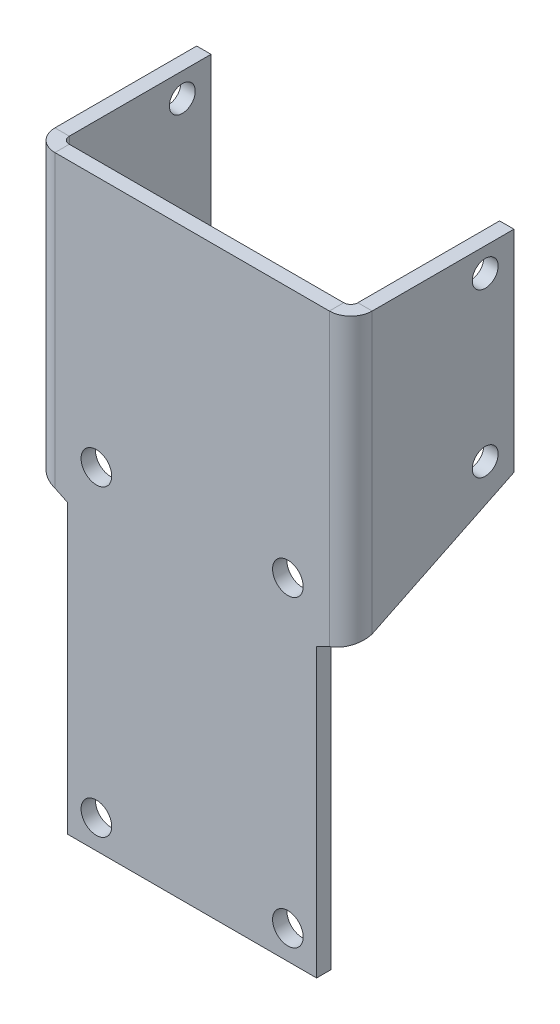
ISO-10303-21;
HEADER;
FILE_DESCRIPTION(('STEP AP214'),'2;1');
FILE_NAME('part.step','',(''),(''),'','','');
FILE_SCHEMA(('AUTOMOTIVE_DESIGN { 1 0 10303 214 1 1 1 1 }'));
ENDSEC;
DATA;
#1=APPLICATION_CONTEXT('core data for automotive mechanical design processes');
#2=APPLICATION_PROTOCOL_DEFINITION('international standard','automotive_design',2000,#1);
#3=PRODUCT_CONTEXT('',#1,'mechanical');
#4=PRODUCT('Part','Part','',(#3));
#5=PRODUCT_RELATED_PRODUCT_CATEGORY('part','',(#4));
#6=PRODUCT_DEFINITION_FORMATION('','',#4);
#7=PRODUCT_DEFINITION_CONTEXT('part definition',#1,'design');
#8=PRODUCT_DEFINITION('design','',#6,#7);
#9=PRODUCT_DEFINITION_SHAPE('','',#8);
#10=(LENGTH_UNIT() NAMED_UNIT(*) SI_UNIT(.MILLI.,.METRE.));
#11=(NAMED_UNIT(*) PLANE_ANGLE_UNIT() SI_UNIT($,.RADIAN.));
#12=(NAMED_UNIT(*) SI_UNIT($,.STERADIAN.) SOLID_ANGLE_UNIT());
#13=UNCERTAINTY_MEASURE_WITH_UNIT(LENGTH_MEASURE(1.E-05),#10,'distance_accuracy_value','');
#14=(GEOMETRIC_REPRESENTATION_CONTEXT(3) GLOBAL_UNCERTAINTY_ASSIGNED_CONTEXT((#13)) GLOBAL_UNIT_ASSIGNED_CONTEXT((#10,
#11,#12)) REPRESENTATION_CONTEXT('',''));
#15=CARTESIAN_POINT('',(0.,0.,0.));
#16=DIRECTION('',(0.,0.,1.));
#17=DIRECTION('',(1.,0.,0.));
#18=AXIS2_PLACEMENT_3D('',#15,#16,#17);
#19=CARTESIAN_POINT('',(-19.475,0.,-1.5));
#20=DIRECTION('',(0.,1.,0.));
#21=DIRECTION('',(-1.,0.,0.));
#22=AXIS2_PLACEMENT_3D('',#19,#20,#21);
#23=PLANE('',#22);
#24=DIRECTION('',(-1.,0.,0.));
#25=VECTOR('',#24,1.);
#26=CARTESIAN_POINT('',(-19.475,0.,-1.5));
#27=LINE('',#26,#25);
#28=CARTESIAN_POINT('',(14.3324270902934,0.,-1.5));
#29=VERTEX_POINT('',#28);
#30=CARTESIAN_POINT('',(-14.3324270902934,0.,-1.5));
#31=VERTEX_POINT('',#30);
#32=EDGE_CURVE('E580',#29,#31,#27,.T.);
#33=ORIENTED_EDGE('',*,*,#32,.T.);
#34=DIRECTION('',(0.,0.,1.));
#35=VECTOR('',#34,1.);
#36=CARTESIAN_POINT('',(-14.3324270902934,0.,-1.5));
#37=LINE('',#36,#35);
#38=CARTESIAN_POINT('',(-14.3324270902934,0.,0.));
#39=VERTEX_POINT('',#38);
#40=EDGE_CURVE('E12',#31,#39,#37,.T.);
#41=ORIENTED_EDGE('',*,*,#40,.T.);
#42=DIRECTION('',(-1.,0.,0.));
#43=VECTOR('',#42,1.);
#44=CARTESIAN_POINT('',(-19.475,0.,0.));
#45=LINE('',#44,#43);
#46=CARTESIAN_POINT('',(14.3324270902934,0.,0.));
#47=VERTEX_POINT('',#46);
#48=EDGE_CURVE('E583',#47,#39,#45,.T.);
#49=ORIENTED_EDGE('',*,*,#48,.F.);
#50=DIRECTION('',(0.,0.,1.));
#51=VECTOR('',#50,1.);
#52=CARTESIAN_POINT('',(14.3324270902934,0.,-1.5));
#53=LINE('',#52,#51);
#54=EDGE_CURVE('E481',#29,#47,#53,.T.);
#55=ORIENTED_EDGE('',*,*,#54,.F.);
#56=EDGE_LOOP('',(#33,#41,#49,#55));
#57=FACE_BOUND('',#56,.T.);
#58=ADVANCED_FACE('F62',(#57),#23,.T.);
#59=CARTESIAN_POINT('',(-31.475,-22.,-1.5));
#60=DIRECTION('',(-0.437944213778862,-0.899002149951609,0.));
#61=DIRECTION('',(0.899002149951609,-0.437944213778862,0.));
#62=AXIS2_PLACEMENT_3D('',#59,#60,#61);
#63=PLANE('',#62);
#64=DIRECTION('',(0.899002149951609,-0.437944213778862,0.));
#65=VECTOR('',#64,1.);
#66=CARTESIAN_POINT('',(-31.475,-22.,0.));
#67=LINE('',#66,#65);
#68=CARTESIAN_POINT('',(-14.3324270902934,-30.3509150845662,0.));
#69=VERTEX_POINT('',#68);
#70=CARTESIAN_POINT('',(-13.,-31.,0.));
#71=VERTEX_POINT('',#70);
#72=EDGE_CURVE('E449',#69,#71,#67,.T.);
#73=ORIENTED_EDGE('',*,*,#72,.F.);
#74=CARTESIAN_POINT('',(-14.3324270902934,-30.3509150845662,-1.5));
#75=CARTESIAN_POINT('',(-14.3324270902933,-30.3509150845662,0.));
#76=B_SPLINE_CURVE_WITH_KNOTS('',1,(#74,#75),.UNSPECIFIED.,.F.,.F.,(2,2),(0.,1.),.UNSPECIFIED.);
#77=CARTESIAN_POINT('',(-14.3324270902934,-30.3509150845662,-1.5));
#78=VERTEX_POINT('',#77);
#79=EDGE_CURVE('E280',#69,#78,#76,.F.);
#80=ORIENTED_EDGE('',*,*,#79,.T.);
#81=DIRECTION('',(0.899002149951609,-0.437944213778862,0.));
#82=VECTOR('',#81,1.);
#83=CARTESIAN_POINT('',(-31.475,-22.,-1.5));
#84=LINE('',#83,#82);
#85=CARTESIAN_POINT('',(-13.,-31.,-1.5));
#86=VERTEX_POINT('',#85);
#87=EDGE_CURVE('E456',#78,#86,#84,.T.);
#88=ORIENTED_EDGE('',*,*,#87,.T.);
#89=DIRECTION('',(0.,0.,1.));
#90=VECTOR('',#89,1.);
#91=CARTESIAN_POINT('',(-13.,-31.,-1.5));
#92=LINE('',#91,#90);
#93=EDGE_CURVE('E478',#86,#71,#92,.T.);
#94=ORIENTED_EDGE('',*,*,#93,.T.);
#95=EDGE_LOOP('',(#73,#80,#88,#94));
#96=FACE_BOUND('',#95,.T.);
#97=ADVANCED_FACE('F517',(#96),#63,.T.);
#98=CARTESIAN_POINT('',(0.,0.,0.));
#99=DIRECTION('',(0.,0.,1.));
#100=DIRECTION('',(1.,0.,0.));
#101=AXIS2_PLACEMENT_3D('',#98,#99,#100);
#102=PLANE('',#101);
#103=CARTESIAN_POINT('',(-10.,-26.3,0.));
#104=DIRECTION('',(0.,0.,1.));
#105=DIRECTION('',(1.,0.,0.));
#106=AXIS2_PLACEMENT_3D('',#103,#104,#105);
#107=CIRCLE('',#106,1.6);
#108=CARTESIAN_POINT('',(-8.40000000000002,-26.3,0.));
#109=VERTEX_POINT('',#108);
#110=EDGE_CURVE('E443',#109,#109,#107,.T.);
#111=ORIENTED_EDGE('',*,*,#110,.F.);
#112=EDGE_LOOP('',(#111));
#113=FACE_BOUND('',#112,.T.);
#114=CARTESIAN_POINT('',(-10.,-58.,0.));
#115=DIRECTION('',(0.,0.,1.));
#116=DIRECTION('',(1.,0.,0.));
#117=AXIS2_PLACEMENT_3D('',#114,#115,#116);
#118=CIRCLE('',#117,1.6);
#119=CARTESIAN_POINT('',(-8.40000000000003,-58.,0.));
#120=VERTEX_POINT('',#119);
#121=EDGE_CURVE('E437',#120,#120,#118,.T.);
#122=ORIENTED_EDGE('',*,*,#121,.F.);
#123=EDGE_LOOP('',(#122));
#124=FACE_BOUND('',#123,.T.);
#125=CARTESIAN_POINT('',(10.,-58.,0.));
#126=DIRECTION('',(0.,0.,1.));
#127=DIRECTION('',(-1.,0.,0.));
#128=AXIS2_PLACEMENT_3D('',#125,#126,#127);
#129=CIRCLE('',#128,1.6);
#130=CARTESIAN_POINT('',(8.40000000000004,-58.,0.));
#131=VERTEX_POINT('',#130);
#132=EDGE_CURVE('E430',#131,#131,#129,.T.);
#133=ORIENTED_EDGE('',*,*,#132,.F.);
#134=EDGE_LOOP('',(#133));
#135=FACE_BOUND('',#134,.T.);
#136=CARTESIAN_POINT('',(10.,-26.3,0.));
#137=DIRECTION('',(0.,0.,1.));
#138=DIRECTION('',(-1.,0.,0.));
#139=AXIS2_PLACEMENT_3D('',#136,#137,#138);
#140=CIRCLE('',#139,1.6);
#141=CARTESIAN_POINT('',(8.40000000000003,-26.3,0.));
#142=VERTEX_POINT('',#141);
#143=EDGE_CURVE('E431',#142,#142,#140,.T.);
#144=ORIENTED_EDGE('',*,*,#143,.F.);
#145=EDGE_LOOP('',(#144));
#146=FACE_BOUND('',#145,.T.);
#147=ORIENTED_EDGE('',*,*,#48,.T.);
#148=DIRECTION('',(0.,-1.,0.));
#149=VECTOR('',#148,1.);
#150=CARTESIAN_POINT('',(-14.3324270902934,0.,0.));
#151=LINE('',#150,#149);
#152=EDGE_CURVE('E70',#39,#69,#151,.T.);
#153=ORIENTED_EDGE('',*,*,#152,.T.);
#154=ORIENTED_EDGE('',*,*,#72,.T.);
#155=DIRECTION('',(0.,-1.,0.));
#156=VECTOR('',#155,1.);
#157=CARTESIAN_POINT('',(-13.,-31.,0.));
#158=LINE('',#157,#156);
#159=CARTESIAN_POINT('',(-13.,-61.,0.));
#160=VERTEX_POINT('',#159);
#161=EDGE_CURVE('E463',#71,#160,#158,.T.);
#162=ORIENTED_EDGE('',*,*,#161,.T.);
#163=DIRECTION('',(1.,0.,0.));
#164=VECTOR('',#163,1.);
#165=CARTESIAN_POINT('',(-13.,-61.,0.));
#166=LINE('',#165,#164);
#167=CARTESIAN_POINT('',(13.,-61.,0.));
#168=VERTEX_POINT('',#167);
#169=EDGE_CURVE('E466',#160,#168,#166,.T.);
#170=ORIENTED_EDGE('',*,*,#169,.T.);
#171=DIRECTION('',(0.,1.,0.));
#172=VECTOR('',#171,1.);
#173=CARTESIAN_POINT('',(13.,-31.,0.));
#174=LINE('',#173,#172);
#175=CARTESIAN_POINT('',(13.,-31.,0.));
#176=VERTEX_POINT('',#175);
#177=EDGE_CURVE('E469',#168,#176,#174,.T.);
#178=ORIENTED_EDGE('',*,*,#177,.T.);
#179=DIRECTION('',(0.899002149951608,0.437944213778862,0.));
#180=VECTOR('',#179,1.);
#181=CARTESIAN_POINT('',(31.475,-22.,0.));
#182=LINE('',#181,#180);
#183=CARTESIAN_POINT('',(14.3324270902934,-30.3509150845662,0.));
#184=VERTEX_POINT('',#183);
#185=EDGE_CURVE('E86',#176,#184,#182,.T.);
#186=ORIENTED_EDGE('',*,*,#185,.T.);
#187=DIRECTION('',(0.,-1.,0.));
#188=VECTOR('',#187,1.);
#189=CARTESIAN_POINT('',(14.3324270902934,0.,0.));
#190=LINE('',#189,#188);
#191=EDGE_CURVE('E484',#47,#184,#190,.T.);
#192=ORIENTED_EDGE('',*,*,#191,.F.);
#193=EDGE_LOOP('',(#147,#153,#154,#162,#170,#178,#186,#192));
#194=FACE_BOUND('',#193,.T.);
#195=ADVANCED_FACE('F515',(#113,#124,#135,#146,#194),#102,.T.);
#196=CARTESIAN_POINT('',(0.,0.,-1.5));
#197=DIRECTION('',(0.,0.,1.));
#198=DIRECTION('',(1.,0.,0.));
#199=AXIS2_PLACEMENT_3D('',#196,#197,#198);
#200=PLANE('',#199);
#201=DIRECTION('',(0.,-1.,0.));
#202=VECTOR('',#201,1.);
#203=CARTESIAN_POINT('',(-14.3324270902934,0.,-1.5));
#204=LINE('',#203,#202);
#205=EDGE_CURVE('E590',#31,#78,#204,.T.);
#206=ORIENTED_EDGE('',*,*,#205,.F.);
#207=ORIENTED_EDGE('',*,*,#32,.F.);
#208=DIRECTION('',(0.,-1.,0.));
#209=VECTOR('',#208,1.);
#210=CARTESIAN_POINT('',(14.3324270902934,0.,-1.5));
#211=LINE('',#210,#209);
#212=CARTESIAN_POINT('',(14.3324270902934,-30.3509150845662,-1.5));
#213=VERTEX_POINT('',#212);
#214=EDGE_CURVE('E473',#29,#213,#211,.T.);
#215=ORIENTED_EDGE('',*,*,#214,.T.);
#216=DIRECTION('',(0.899002149951608,0.437944213778862,0.));
#217=VECTOR('',#216,1.);
#218=CARTESIAN_POINT('',(31.475,-22.,-1.5));
#219=LINE('',#218,#217);
#220=CARTESIAN_POINT('',(13.,-31.,-1.5));
#221=VERTEX_POINT('',#220);
#222=EDGE_CURVE('E462',#221,#213,#219,.T.);
#223=ORIENTED_EDGE('',*,*,#222,.F.);
#224=DIRECTION('',(0.,1.,0.));
#225=VECTOR('',#224,1.);
#226=CARTESIAN_POINT('',(13.,-31.,-1.5));
#227=LINE('',#226,#225);
#228=CARTESIAN_POINT('',(13.,-61.,-1.5));
#229=VERTEX_POINT('',#228);
#230=EDGE_CURVE('E459',#229,#221,#227,.T.);
#231=ORIENTED_EDGE('',*,*,#230,.F.);
#232=DIRECTION('',(1.,0.,0.));
#233=VECTOR('',#232,1.);
#234=CARTESIAN_POINT('',(-13.,-61.,-1.5));
#235=LINE('',#234,#233);
#236=CARTESIAN_POINT('',(-13.,-61.,-1.5));
#237=VERTEX_POINT('',#236);
#238=EDGE_CURVE('E455',#237,#229,#235,.T.);
#239=ORIENTED_EDGE('',*,*,#238,.F.);
#240=DIRECTION('',(0.,-1.,0.));
#241=VECTOR('',#240,1.);
#242=CARTESIAN_POINT('',(-13.,-31.,-1.5));
#243=LINE('',#242,#241);
#244=EDGE_CURVE('E452',#86,#237,#243,.T.);
#245=ORIENTED_EDGE('',*,*,#244,.F.);
#246=ORIENTED_EDGE('',*,*,#87,.F.);
#247=EDGE_LOOP('',(#206,#207,#215,#223,#231,#239,#245,#246));
#248=FACE_BOUND('',#247,.T.);
#249=CARTESIAN_POINT('',(-10.,-26.3,-1.5));
#250=DIRECTION('',(0.,0.,1.));
#251=DIRECTION('',(1.,0.,0.));
#252=AXIS2_PLACEMENT_3D('',#249,#250,#251);
#253=CIRCLE('',#252,1.6);
#254=CARTESIAN_POINT('',(-8.40000000000002,-26.3,-1.5));
#255=VERTEX_POINT('',#254);
#256=EDGE_CURVE('E446',#255,#255,#253,.T.);
#257=ORIENTED_EDGE('',*,*,#256,.T.);
#258=EDGE_LOOP('',(#257));
#259=FACE_BOUND('',#258,.T.);
#260=CARTESIAN_POINT('',(-10.,-58.,-1.5));
#261=DIRECTION('',(0.,0.,1.));
#262=DIRECTION('',(1.,0.,0.));
#263=AXIS2_PLACEMENT_3D('',#260,#261,#262);
#264=CIRCLE('',#263,1.6);
#265=CARTESIAN_POINT('',(-8.40000000000003,-58.,-1.5));
#266=VERTEX_POINT('',#265);
#267=EDGE_CURVE('E440',#266,#266,#264,.T.);
#268=ORIENTED_EDGE('',*,*,#267,.T.);
#269=EDGE_LOOP('',(#268));
#270=FACE_BOUND('',#269,.T.);
#271=CARTESIAN_POINT('',(10.,-58.,-1.5));
#272=DIRECTION('',(0.,0.,1.));
#273=DIRECTION('',(-1.,0.,0.));
#274=AXIS2_PLACEMENT_3D('',#271,#272,#273);
#275=CIRCLE('',#274,1.6);
#276=CARTESIAN_POINT('',(8.40000000000004,-58.,-1.5));
#277=VERTEX_POINT('',#276);
#278=EDGE_CURVE('E434',#277,#277,#275,.T.);
#279=ORIENTED_EDGE('',*,*,#278,.T.);
#280=EDGE_LOOP('',(#279));
#281=FACE_BOUND('',#280,.T.);
#282=CARTESIAN_POINT('',(10.,-26.3,-1.5));
#283=DIRECTION('',(0.,0.,1.));
#284=DIRECTION('',(-1.,0.,0.));
#285=AXIS2_PLACEMENT_3D('',#282,#283,#284);
#286=CIRCLE('',#285,1.6);
#287=CARTESIAN_POINT('',(8.40000000000003,-26.3,-1.5));
#288=VERTEX_POINT('',#287);
#289=EDGE_CURVE('E422',#288,#288,#286,.T.);
#290=ORIENTED_EDGE('',*,*,#289,.T.);
#291=EDGE_LOOP('',(#290));
#292=FACE_BOUND('',#291,.T.);
#293=ADVANCED_FACE('F510',(#248,#259,#270,#281,#292),#200,.F.);
#294=CARTESIAN_POINT('',(31.475,-22.,-1.5));
#295=DIRECTION('',(0.437944213778862,-0.899002149951608,0.));
#296=DIRECTION('',(0.899002149951608,0.437944213778862,0.));
#297=AXIS2_PLACEMENT_3D('',#294,#295,#296);
#298=PLANE('',#297);
#299=CARTESIAN_POINT('',(14.3324270902934,-30.3509150845662,0.));
#300=CARTESIAN_POINT('',(14.3324270902934,-30.3509150845662,-1.5));
#301=B_SPLINE_CURVE_WITH_KNOTS('',1,(#299,#300),.UNSPECIFIED.,.F.,.F.,(2,2),(0.,1.),.UNSPECIFIED.);
#302=EDGE_CURVE('E418',#184,#213,#301,.T.);
#303=ORIENTED_EDGE('',*,*,#302,.F.);
#304=ORIENTED_EDGE('',*,*,#185,.F.);
#305=DIRECTION('',(0.,0.,1.));
#306=VECTOR('',#305,1.);
#307=CARTESIAN_POINT('',(13.,-31.,-1.5));
#308=LINE('',#307,#306);
#309=EDGE_CURVE('E471',#221,#176,#308,.T.);
#310=ORIENTED_EDGE('',*,*,#309,.F.);
#311=ORIENTED_EDGE('',*,*,#222,.T.);
#312=EDGE_LOOP('',(#303,#304,#310,#311));
#313=FACE_BOUND('',#312,.T.);
#314=ADVANCED_FACE('F499',(#313),#298,.T.);
#315=CARTESIAN_POINT('',(13.,-31.,-1.5));
#316=DIRECTION('',(1.,0.,0.));
#317=DIRECTION('',(0.,1.,0.));
#318=AXIS2_PLACEMENT_3D('',#315,#316,#317);
#319=PLANE('',#318);
#320=ORIENTED_EDGE('',*,*,#177,.F.);
#321=DIRECTION('',(0.,0.,1.));
#322=VECTOR('',#321,1.);
#323=CARTESIAN_POINT('',(13.,-61.,-1.5));
#324=LINE('',#323,#322);
#325=EDGE_CURVE('E474',#229,#168,#324,.T.);
#326=ORIENTED_EDGE('',*,*,#325,.F.);
#327=ORIENTED_EDGE('',*,*,#230,.T.);
#328=ORIENTED_EDGE('',*,*,#309,.T.);
#329=EDGE_LOOP('',(#320,#326,#327,#328));
#330=FACE_BOUND('',#329,.T.);
#331=ADVANCED_FACE('F509',(#330),#319,.T.);
#332=CARTESIAN_POINT('',(-13.,-61.,-1.5));
#333=DIRECTION('',(0.,-1.,0.));
#334=DIRECTION('',(0.,0.,-1.));
#335=AXIS2_PLACEMENT_3D('',#332,#333,#334);
#336=PLANE('',#335);
#337=ORIENTED_EDGE('',*,*,#169,.F.);
#338=DIRECTION('',(0.,0.,1.));
#339=VECTOR('',#338,1.);
#340=CARTESIAN_POINT('',(-13.,-61.,-1.5));
#341=LINE('',#340,#339);
#342=EDGE_CURVE('E476',#237,#160,#341,.T.);
#343=ORIENTED_EDGE('',*,*,#342,.F.);
#344=ORIENTED_EDGE('',*,*,#238,.T.);
#345=ORIENTED_EDGE('',*,*,#325,.T.);
#346=EDGE_LOOP('',(#337,#343,#344,#345));
#347=FACE_BOUND('',#346,.T.);
#348=ADVANCED_FACE('F610',(#347),#336,.T.);
#349=CARTESIAN_POINT('',(-13.,-31.,-1.5));
#350=DIRECTION('',(-1.,0.,0.));
#351=DIRECTION('',(0.,-1.,0.));
#352=AXIS2_PLACEMENT_3D('',#349,#350,#351);
#353=PLANE('',#352);
#354=ORIENTED_EDGE('',*,*,#161,.F.);
#355=ORIENTED_EDGE('',*,*,#93,.F.);
#356=ORIENTED_EDGE('',*,*,#244,.T.);
#357=ORIENTED_EDGE('',*,*,#342,.T.);
#358=EDGE_LOOP('',(#354,#355,#356,#357));
#359=FACE_BOUND('',#358,.T.);
#360=ADVANCED_FACE('F511',(#359),#353,.T.);
#361=CARTESIAN_POINT('',(-10.,-26.3,-1.5));
#362=DIRECTION('',(0.,0.,1.));
#363=DIRECTION('',(1.,0.,0.));
#364=AXIS2_PLACEMENT_3D('',#361,#362,#363);
#365=CYLINDRICAL_SURFACE('',#364,1.6);
#366=ORIENTED_EDGE('',*,*,#256,.F.);
#367=EDGE_LOOP('',(#366));
#368=FACE_BOUND('',#367,.T.);
#369=ORIENTED_EDGE('',*,*,#110,.T.);
#370=EDGE_LOOP('',(#369));
#371=FACE_BOUND('',#370,.T.);
#372=ADVANCED_FACE('F824',(#368,#371),#365,.F.);
#373=CARTESIAN_POINT('',(-10.,-58.,-1.5));
#374=DIRECTION('',(0.,0.,1.));
#375=DIRECTION('',(1.,0.,0.));
#376=AXIS2_PLACEMENT_3D('',#373,#374,#375);
#377=CYLINDRICAL_SURFACE('',#376,1.6);
#378=ORIENTED_EDGE('',*,*,#267,.F.);
#379=EDGE_LOOP('',(#378));
#380=FACE_BOUND('',#379,.T.);
#381=ORIENTED_EDGE('',*,*,#121,.T.);
#382=EDGE_LOOP('',(#381));
#383=FACE_BOUND('',#382,.T.);
#384=ADVANCED_FACE('F813',(#380,#383),#377,.F.);
#385=CARTESIAN_POINT('',(10.,-58.,-1.5));
#386=DIRECTION('',(0.,0.,1.));
#387=DIRECTION('',(1.,0.,0.));
#388=AXIS2_PLACEMENT_3D('',#385,#386,#387);
#389=CYLINDRICAL_SURFACE('',#388,1.6);
#390=ORIENTED_EDGE('',*,*,#278,.F.);
#391=EDGE_LOOP('',(#390));
#392=FACE_BOUND('',#391,.T.);
#393=ORIENTED_EDGE('',*,*,#132,.T.);
#394=EDGE_LOOP('',(#393));
#395=FACE_BOUND('',#394,.T.);
#396=ADVANCED_FACE('F803',(#392,#395),#389,.F.);
#397=CARTESIAN_POINT('',(10.,-26.3,-1.5));
#398=DIRECTION('',(0.,0.,1.));
#399=DIRECTION('',(1.,0.,0.));
#400=AXIS2_PLACEMENT_3D('',#397,#398,#399);
#401=CYLINDRICAL_SURFACE('',#400,1.6);
#402=ORIENTED_EDGE('',*,*,#289,.F.);
#403=EDGE_LOOP('',(#402));
#404=FACE_BOUND('',#403,.T.);
#405=ORIENTED_EDGE('',*,*,#143,.T.);
#406=EDGE_LOOP('',(#405));
#407=FACE_BOUND('',#406,.T.);
#408=ADVANCED_FACE('F756',(#404,#407),#401,.F.);
#409=CARTESIAN_POINT('',(14.3324270902934,0.,-2.2366));
#410=DIRECTION('',(0.,-1.,0.));
#411=DIRECTION('',(0.,0.,-1.));
#412=AXIS2_PLACEMENT_3D('',#409,#410,#411);
#413=PLANE('',#412);
#414=ORIENTED_EDGE('',*,*,#54,.T.);
#415=CARTESIAN_POINT('',(14.3324270902934,0.,-2.2366));
#416=DIRECTION('',(0.,-1.,0.));
#417=DIRECTION('',(0.,0.,-1.));
#418=AXIS2_PLACEMENT_3D('',#415,#416,#417);
#419=CIRCLE('',#418,2.2366);
#420=CARTESIAN_POINT('',(16.5690270902933,0.,-2.23660000000001));
#421=VERTEX_POINT('',#420);
#422=EDGE_CURVE('E302',#47,#421,#419,.F.);
#423=ORIENTED_EDGE('',*,*,#422,.T.);
#424=DIRECTION('',(1.,0.,0.));
#425=VECTOR('',#424,1.);
#426=CARTESIAN_POINT('',(15.0690270902933,0.,-2.23660000000001));
#427=LINE('',#426,#425);
#428=CARTESIAN_POINT('',(15.0690270902933,0.,-2.23660000000001));
#429=VERTEX_POINT('',#428);
#430=EDGE_CURVE('E312',#429,#421,#427,.T.);
#431=ORIENTED_EDGE('',*,*,#430,.F.);
#432=CARTESIAN_POINT('',(14.3324270902934,0.,-2.2366));
#433=DIRECTION('',(0.,1.,0.));
#434=DIRECTION('',(0.,0.,-1.));
#435=AXIS2_PLACEMENT_3D('',#432,#433,#434);
#436=CIRCLE('',#435,0.7366);
#437=EDGE_CURVE('E337',#29,#429,#436,.T.);
#438=ORIENTED_EDGE('',*,*,#437,.F.);
#439=EDGE_LOOP('',(#414,#423,#431,#438));
#440=FACE_BOUND('',#439,.T.);
#441=ADVANCED_FACE('F598',(#440),#413,.F.);
#442=CARTESIAN_POINT('',(16.5690270902934,-29.2133609641483,-2.23660000000001));
#443=CARTESIAN_POINT('',(16.5690270902934,-29.3081726105013,-1.94378196786791));
#444=CARTESIAN_POINT('',(16.5108143789297,-29.4029533175513,-1.65117468184204));
#445=CARTESIAN_POINT('',(16.2867377264865,-29.5925456709543,-1.11020578850245));
#446=CARTESIAN_POINT('',(16.1209619500011,-29.6873418476557,-0.86210480610411));
#447=CARTESIAN_POINT('',(15.7069222841893,-29.8769342010587,-0.448065140292233));
#448=CARTESIAN_POINT('',(15.4588213017909,-29.9717303777602,-0.282289363806868));
#449=CARTESIAN_POINT('',(14.9178524084513,-30.1613227311632,-0.0582127113636455));
#450=CARTESIAN_POINT('',(14.6252451224255,-30.2561034382131,0.));
#451=CARTESIAN_POINT('',(14.3324270902934,-30.3509150845662,0.));
#452=CARTESIAN_POINT('',(15.0690270902934,-29.2133609641483,-2.2366));
#453=CARTESIAN_POINT('',(15.0690270902934,-29.3081658317912,-2.14017044559401));
#454=CARTESIAN_POINT('',(15.0498553639272,-29.4029533175513,-2.04379650838096));
#455=CARTESIAN_POINT('',(14.9760581439551,-29.5925456709543,-1.8656342590588));
#456=CARTESIAN_POINT('',(14.9214616864039,-29.6873418476557,-1.78392488606648));
#457=CARTESIAN_POINT('',(14.7851022042269,-29.8769342010587,-1.6475654038895));
#458=CARTESIAN_POINT('',(14.7033928312346,-29.9717303777602,-1.59296894633825));
#459=CARTESIAN_POINT('',(14.5252305819124,-30.1613227311632,-1.51917172636612));
#460=CARTESIAN_POINT('',(14.4288566446993,-30.2561102169232,-1.5));
#461=CARTESIAN_POINT('',(14.3324270902934,-30.3509150845662,-1.5));
#462=B_SPLINE_SURFACE_WITH_KNOTS('',1,3,((#442,#443,#444,#445,#446,#447,#448,#449,#450,#451),
(#452,#453,#454,#455,#456,#457,#458,#459,#460,#461)),.UNSPECIFIED.,.F.,.F.,.F.,(2,2),(4,2,2,2,
4),(0.,1.),(0.,0.25,0.5,0.75,1.),.UNSPECIFIED.);
#463=CARTESIAN_POINT('',(15.0690270902934,-29.2133609641483,-2.2366));
#464=CARTESIAN_POINT('',(16.5690270902934,-29.2133609641483,-2.23660000000001));
#465=B_SPLINE_CURVE_WITH_KNOTS('',1,(#463,#464),.UNSPECIFIED.,.F.,.F.,(2,2),(0.,1.),.UNSPECIFIED.);
#466=CARTESIAN_POINT('',(16.5690270902933,-29.2133609641483,-2.23660000000001));
#467=VERTEX_POINT('',#466);
#468=CARTESIAN_POINT('',(15.0690270902934,-29.2133609641483,-2.2366));
#469=VERTEX_POINT('',#468);
#470=EDGE_CURVE('E307',#467,#469,#465,.F.);
#471=CARTESIAN_POINT('',(16.5690270902934,-29.2133609641483,-2.23660000000001));
#472=CARTESIAN_POINT('',(16.5690270902934,-29.3081726105013,-1.94378196786791));
#473=CARTESIAN_POINT('',(16.5108143789297,-29.4029533175513,-1.65117468184204));
#474=CARTESIAN_POINT('',(16.2867377264865,-29.5925456709543,-1.11020578850245));
#475=CARTESIAN_POINT('',(16.1209619500011,-29.6873418476557,-0.86210480610411));
#476=CARTESIAN_POINT('',(15.7069222841893,-29.8769342010587,-0.448065140292233));
#477=CARTESIAN_POINT('',(15.4588213017909,-29.9717303777602,-0.282289363806868));
#478=CARTESIAN_POINT('',(14.9178524084513,-30.1613227311632,-0.0582127113636455));
#479=CARTESIAN_POINT('',(14.6252451224255,-30.2561034382131,0.));
#480=CARTESIAN_POINT('',(14.3324270902934,-30.3509150845662,0.));
#481=B_SPLINE_CURVE_WITH_KNOTS('',3,(#471,#472,#473,#474,#475,#476,#477,#478,#479,#480),
.UNSPECIFIED.,.F.,.F.,(4,2,2,2,4),(0.,0.25,0.5,0.75,1.),.UNSPECIFIED.);
#482=EDGE_CURVE('E341',#467,#184,#481,.T.);
#483=CARTESIAN_POINT('',(14.3324270902934,-30.3509150845662,-1.5));
#484=CARTESIAN_POINT('',(14.4288566446993,-30.2561102169232,-1.5));
#485=CARTESIAN_POINT('',(14.5252305819124,-30.1613227311632,-1.51917172636612));
#486=CARTESIAN_POINT('',(14.7033928312346,-29.9717303777602,-1.59296894633825));
#487=CARTESIAN_POINT('',(14.7851022042269,-29.8769342010587,-1.6475654038895));
#488=CARTESIAN_POINT('',(14.9214616864039,-29.6873418476557,-1.78392488606648));
#489=CARTESIAN_POINT('',(14.9760581439551,-29.5925456709543,-1.8656342590588));
#490=CARTESIAN_POINT('',(15.0498553639272,-29.4029533175513,-2.04379650838096));
#491=CARTESIAN_POINT('',(15.0690270902934,-29.3081658317912,-2.14017044559401));
#492=CARTESIAN_POINT('',(15.0690270902934,-29.2133609641483,-2.2366));
#493=B_SPLINE_CURVE_WITH_KNOTS('',3,(#483,#484,#485,#486,#487,#488,#489,#490,#491,#492),
.UNSPECIFIED.,.F.,.F.,(4,2,2,2,4),(0.,0.25,0.5,0.75,1.),.UNSPECIFIED.);
#494=EDGE_CURVE('E340',#469,#213,#493,.F.);
#495=ORIENTED_EDGE('',*,*,#470,.F.);
#496=ORIENTED_EDGE('',*,*,#482,.T.);
#497=ORIENTED_EDGE('',*,*,#302,.T.);
#498=ORIENTED_EDGE('',*,*,#494,.F.);
#499=EDGE_LOOP('',(#495,#496,#497,#498));
#500=FACE_BOUND('',#499,.T.);
#501=ADVANCED_FACE('F358',(#500),#462,.F.);
#502=CARTESIAN_POINT('',(14.3324270902934,15.3020907919985,-2.2366));
#503=DIRECTION('',(0.,-1.,0.));
#504=DIRECTION('',(0.,0.,-1.));
#505=AXIS2_PLACEMENT_3D('',#502,#503,#504);
#506=CYLINDRICAL_SURFACE('',#505,0.7366);
#507=ORIENTED_EDGE('',*,*,#494,.T.);
#508=ORIENTED_EDGE('',*,*,#214,.F.);
#509=ORIENTED_EDGE('',*,*,#437,.T.);
#510=DIRECTION('',(0.,-1.,0.));
#511=VECTOR('',#510,1.);
#512=CARTESIAN_POINT('',(15.0690270902933,0.,-2.2366));
#513=LINE('',#512,#511);
#514=EDGE_CURVE('E336',#429,#469,#513,.T.);
#515=ORIENTED_EDGE('',*,*,#514,.T.);
#516=EDGE_LOOP('',(#507,#508,#509,#515));
#517=FACE_BOUND('',#516,.T.);
#518=ADVANCED_FACE('F347',(#517),#506,.F.);
#519=CARTESIAN_POINT('',(14.3324270902934,15.3020907919985,-2.2366));
#520=DIRECTION('',(0.,-1.,0.));
#521=DIRECTION('',(0.,0.,-1.));
#522=AXIS2_PLACEMENT_3D('',#519,#520,#521);
#523=CYLINDRICAL_SURFACE('',#522,2.2366);
#524=ORIENTED_EDGE('',*,*,#482,.F.);
#525=DIRECTION('',(0.,-1.,0.));
#526=VECTOR('',#525,1.);
#527=CARTESIAN_POINT('',(16.5690270902933,0.,-2.23660000000001));
#528=LINE('',#527,#526);
#529=EDGE_CURVE('E311',#421,#467,#528,.T.);
#530=ORIENTED_EDGE('',*,*,#529,.F.);
#531=ORIENTED_EDGE('',*,*,#422,.F.);
#532=ORIENTED_EDGE('',*,*,#191,.T.);
#533=EDGE_LOOP('',(#524,#530,#531,#532));
#534=FACE_BOUND('',#533,.T.);
#535=ADVANCED_FACE('F357',(#534),#523,.T.);
#536=CARTESIAN_POINT('',(15.0690270902933,-19.5,-14.0440270902934));
#537=DIRECTION('',(1.,0.,0.));
#538=DIRECTION('',(0.,0.,-1.));
#539=AXIS2_PLACEMENT_3D('',#536,#537,#538);
#540=CYLINDRICAL_SURFACE('',#539,1.35);
#541=CARTESIAN_POINT('',(15.0690270902933,-19.5,-14.0440270902934));
#542=DIRECTION('',(1.,0.,0.));
#543=DIRECTION('',(0.,0.,1.));
#544=AXIS2_PLACEMENT_3D('',#541,#542,#543);
#545=CIRCLE('',#544,1.35);
#546=CARTESIAN_POINT('',(15.0690270902933,-19.5,-12.6940270902934));
#547=VERTEX_POINT('',#546);
#548=EDGE_CURVE('E318',#547,#547,#545,.T.);
#549=ORIENTED_EDGE('',*,*,#548,.F.);
#550=EDGE_LOOP('',(#549));
#551=FACE_BOUND('',#550,.T.);
#552=CARTESIAN_POINT('',(16.5690270902933,-19.5,-14.0440270902934));
#553=DIRECTION('',(1.,0.,0.));
#554=DIRECTION('',(0.,0.,1.));
#555=AXIS2_PLACEMENT_3D('',#552,#553,#554);
#556=CIRCLE('',#555,1.35);
#557=CARTESIAN_POINT('',(16.5690270902933,-19.5,-12.6940270902934));
#558=VERTEX_POINT('',#557);
#559=EDGE_CURVE('E333',#558,#558,#556,.T.);
#560=ORIENTED_EDGE('',*,*,#559,.T.);
#561=EDGE_LOOP('',(#560));
#562=FACE_BOUND('',#561,.T.);
#563=ADVANCED_FACE('F366',(#551,#562),#540,.F.);
#564=CARTESIAN_POINT('',(15.0690270902933,-2.49999999999999,-14.0440270902934));
#565=DIRECTION('',(1.,0.,0.));
#566=DIRECTION('',(0.,0.,-1.));
#567=AXIS2_PLACEMENT_3D('',#564,#565,#566);
#568=CYLINDRICAL_SURFACE('',#567,1.35);
#569=CARTESIAN_POINT('',(15.0690270902933,-2.49999999999999,-14.0440270902934));
#570=DIRECTION('',(1.,0.,0.));
#571=DIRECTION('',(0.,0.,1.));
#572=AXIS2_PLACEMENT_3D('',#569,#570,#571);
#573=CIRCLE('',#572,1.35);
#574=CARTESIAN_POINT('',(15.0690270902933,-2.49999999999999,-12.6940270902934));
#575=VERTEX_POINT('',#574);
#576=EDGE_CURVE('E321',#575,#575,#573,.T.);
#577=ORIENTED_EDGE('',*,*,#576,.F.);
#578=EDGE_LOOP('',(#577));
#579=FACE_BOUND('',#578,.T.);
#580=CARTESIAN_POINT('',(16.5690270902933,-2.49999999999999,-14.0440270902934));
#581=DIRECTION('',(1.,0.,0.));
#582=DIRECTION('',(0.,0.,1.));
#583=AXIS2_PLACEMENT_3D('',#580,#581,#582);
#584=CIRCLE('',#583,1.35);
#585=CARTESIAN_POINT('',(16.5690270902933,-2.49999999999999,-12.6940270902934));
#586=VERTEX_POINT('',#585);
#587=EDGE_CURVE('E330',#586,#586,#584,.T.);
#588=ORIENTED_EDGE('',*,*,#587,.T.);
#589=EDGE_LOOP('',(#588));
#590=FACE_BOUND('',#589,.T.);
#591=ADVANCED_FACE('F672',(#579,#590),#568,.F.);
#592=CARTESIAN_POINT('',(15.0690270902933,0.,-17.0440270902934));
#593=DIRECTION('',(0.,0.,-1.));
#594=DIRECTION('',(-1.,0.,0.));
#595=AXIS2_PLACEMENT_3D('',#592,#593,#594);
#596=PLANE('',#595);
#597=DIRECTION('',(0.,1.,0.));
#598=VECTOR('',#597,1.);
#599=CARTESIAN_POINT('',(16.5690270902933,0.,-17.0440270902934));
#600=LINE('',#599,#598);
#601=CARTESIAN_POINT('',(16.5690270902933,-22.,-17.0440270902934));
#602=VERTEX_POINT('',#601);
#603=CARTESIAN_POINT('',(16.5690270902933,0.,-17.0440270902934));
#604=VERTEX_POINT('',#603);
#605=EDGE_CURVE('E304',#602,#604,#600,.T.);
#606=ORIENTED_EDGE('',*,*,#605,.F.);
#607=DIRECTION('',(1.,0.,0.));
#608=VECTOR('',#607,1.);
#609=CARTESIAN_POINT('',(15.0690270902933,-22.,-17.0440270902934));
#610=LINE('',#609,#608);
#611=CARTESIAN_POINT('',(15.0690270902933,-22.,-17.0440270902934));
#612=VERTEX_POINT('',#611);
#613=EDGE_CURVE('E294',#612,#602,#610,.T.);
#614=ORIENTED_EDGE('',*,*,#613,.F.);
#615=DIRECTION('',(0.,1.,0.));
#616=VECTOR('',#615,1.);
#617=CARTESIAN_POINT('',(15.0690270902933,0.,-17.0440270902934));
#618=LINE('',#617,#616);
#619=CARTESIAN_POINT('',(15.0690270902933,0.,-17.0440270902934));
#620=VERTEX_POINT('',#619);
#621=EDGE_CURVE('E327',#612,#620,#618,.T.);
#622=ORIENTED_EDGE('',*,*,#621,.T.);
#623=DIRECTION('',(1.,0.,0.));
#624=VECTOR('',#623,1.);
#625=CARTESIAN_POINT('',(15.0690270902933,0.,-17.0440270902934));
#626=LINE('',#625,#624);
#627=EDGE_CURVE('E324',#620,#604,#626,.T.);
#628=ORIENTED_EDGE('',*,*,#627,.T.);
#629=EDGE_LOOP('',(#606,#614,#622,#628));
#630=FACE_BOUND('',#629,.T.);
#631=ADVANCED_FACE('F656',(#630),#596,.T.);
#632=CARTESIAN_POINT('',(15.0690270902934,0.,14.4309729097066));
#633=DIRECTION('',(1.,0.,0.));
#634=DIRECTION('',(0.,0.,-1.));
#635=AXIS2_PLACEMENT_3D('',#632,#633,#634);
#636=PLANE('',#635);
#637=ORIENTED_EDGE('',*,*,#514,.F.);
#638=DIRECTION('',(0.,0.,1.));
#639=VECTOR('',#638,1.);
#640=CARTESIAN_POINT('',(15.0690270902935,0.,33.9059729097066));
#641=LINE('',#640,#639);
#642=EDGE_CURVE('E315',#620,#429,#641,.T.);
#643=ORIENTED_EDGE('',*,*,#642,.F.);
#644=ORIENTED_EDGE('',*,*,#621,.F.);
#645=DIRECTION('',(0.,0.437944213778862,-0.899002149951608));
#646=VECTOR('',#645,1.);
#647=CARTESIAN_POINT('',(15.0690270902933,-22.,-17.0440270902934));
#648=LINE('',#647,#646);
#649=EDGE_CURVE('E303',#469,#612,#648,.T.);
#650=ORIENTED_EDGE('',*,*,#649,.F.);
#651=EDGE_LOOP('',(#637,#643,#644,#650));
#652=FACE_BOUND('',#651,.T.);
#653=ORIENTED_EDGE('',*,*,#576,.T.);
#654=EDGE_LOOP('',(#653));
#655=FACE_BOUND('',#654,.T.);
#656=ORIENTED_EDGE('',*,*,#548,.T.);
#657=EDGE_LOOP('',(#656));
#658=FACE_BOUND('',#657,.T.);
#659=ADVANCED_FACE('F647',(#652,#655,#658),#636,.F.);
#660=CARTESIAN_POINT('',(15.0690270902935,0.,33.9059729097066));
#661=DIRECTION('',(0.,1.,0.));
#662=DIRECTION('',(0.,0.,1.));
#663=AXIS2_PLACEMENT_3D('',#660,#661,#662);
#664=PLANE('',#663);
#665=ORIENTED_EDGE('',*,*,#642,.T.);
#666=ORIENTED_EDGE('',*,*,#430,.T.);
#667=DIRECTION('',(0.,0.,1.));
#668=VECTOR('',#667,1.);
#669=CARTESIAN_POINT('',(16.5690270902935,0.,33.9059729097066));
#670=LINE('',#669,#668);
#671=EDGE_CURVE('E309',#604,#421,#670,.T.);
#672=ORIENTED_EDGE('',*,*,#671,.F.);
#673=ORIENTED_EDGE('',*,*,#627,.F.);
#674=EDGE_LOOP('',(#665,#666,#672,#673));
#675=FACE_BOUND('',#674,.T.);
#676=ADVANCED_FACE('F660',(#675),#664,.T.);
#677=CARTESIAN_POINT('',(16.5690270902934,0.,14.4309729097066));
#678=DIRECTION('',(1.,0.,0.));
#679=DIRECTION('',(0.,0.,-1.));
#680=AXIS2_PLACEMENT_3D('',#677,#678,#679);
#681=PLANE('',#680);
#682=ORIENTED_EDGE('',*,*,#559,.F.);
#683=EDGE_LOOP('',(#682));
#684=FACE_BOUND('',#683,.T.);
#685=ORIENTED_EDGE('',*,*,#587,.F.);
#686=EDGE_LOOP('',(#685));
#687=FACE_BOUND('',#686,.T.);
#688=ORIENTED_EDGE('',*,*,#671,.T.);
#689=ORIENTED_EDGE('',*,*,#529,.T.);
#690=DIRECTION('',(0.,0.437944213778862,-0.899002149951608));
#691=VECTOR('',#690,1.);
#692=CARTESIAN_POINT('',(16.5690270902933,-22.,-17.0440270902934));
#693=LINE('',#692,#691);
#694=EDGE_CURVE('E308',#467,#602,#693,.T.);
#695=ORIENTED_EDGE('',*,*,#694,.T.);
#696=ORIENTED_EDGE('',*,*,#605,.T.);
#697=EDGE_LOOP('',(#688,#689,#695,#696));
#698=FACE_BOUND('',#697,.T.);
#699=ADVANCED_FACE('F658',(#684,#687,#698),#681,.T.);
#700=CARTESIAN_POINT('',(15.0690270902933,-22.,-17.0440270902934));
#701=DIRECTION('',(0.,-0.899002149951608,-0.437944213778862));
#702=DIRECTION('',(0.,0.437944213778862,-0.899002149951608));
#703=AXIS2_PLACEMENT_3D('',#700,#701,#702);
#704=PLANE('',#703);
#705=ORIENTED_EDGE('',*,*,#694,.F.);
#706=ORIENTED_EDGE('',*,*,#470,.T.);
#707=ORIENTED_EDGE('',*,*,#649,.T.);
#708=ORIENTED_EDGE('',*,*,#613,.T.);
#709=EDGE_LOOP('',(#705,#706,#707,#708));
#710=FACE_BOUND('',#709,.T.);
#711=ADVANCED_FACE('F360',(#710),#704,.T.);
#712=CARTESIAN_POINT('',(-14.3324270902934,0.,-2.2366));
#713=DIRECTION('',(0.,-1.,0.));
#714=DIRECTION('',(1.,0.,0.));
#715=AXIS2_PLACEMENT_3D('',#712,#713,#714);
#716=PLANE('',#715);
#717=DIRECTION('',(-1.,0.,0.));
#718=VECTOR('',#717,1.);
#719=CARTESIAN_POINT('',(-15.0690270902933,0.,-2.2366));
#720=LINE('',#719,#718);
#721=CARTESIAN_POINT('',(-15.0690270902933,0.,-2.2366));
#722=VERTEX_POINT('',#721);
#723=CARTESIAN_POINT('',(-16.5690270902933,0.,-2.23660000000001));
#724=VERTEX_POINT('',#723);
#725=EDGE_CURVE('E184',#722,#724,#720,.T.);
#726=ORIENTED_EDGE('',*,*,#725,.T.);
#727=CARTESIAN_POINT('',(-14.3324270902933,0.,-2.2366));
#728=DIRECTION('',(0.,1.,0.));
#729=DIRECTION('',(-1.,0.,0.));
#730=AXIS2_PLACEMENT_3D('',#727,#728,#729);
#731=CIRCLE('',#730,2.2366);
#732=EDGE_CURVE('E78',#724,#39,#731,.T.);
#733=ORIENTED_EDGE('',*,*,#732,.T.);
#734=ORIENTED_EDGE('',*,*,#40,.F.);
#735=CARTESIAN_POINT('',(-14.3324270902934,0.,-2.2366));
#736=DIRECTION('',(0.,1.,0.));
#737=DIRECTION('',(1.,0.,0.));
#738=AXIS2_PLACEMENT_3D('',#735,#736,#737);
#739=CIRCLE('',#738,0.736599999999999);
#740=EDGE_CURVE('E211',#722,#31,#739,.T.);
#741=ORIENTED_EDGE('',*,*,#740,.F.);
#742=EDGE_LOOP('',(#726,#733,#734,#741));
#743=FACE_BOUND('',#742,.T.);
#744=ADVANCED_FACE('F616',(#743),#716,.F.);
#745=CARTESIAN_POINT('',(-14.3324270902933,-30.3509150845662,0.));
#746=CARTESIAN_POINT('',(-14.6252451224255,-30.2561034382131,0.));
#747=CARTESIAN_POINT('',(-14.9178524084513,-30.1613227311632,-0.0582127113636454));
#748=CARTESIAN_POINT('',(-15.4588213017909,-29.9717303777602,-0.282289363806867));
#749=CARTESIAN_POINT('',(-15.7069222841892,-29.8769342010587,-0.44806514029223));
#750=CARTESIAN_POINT('',(-16.1209619500011,-29.6873418476558,-0.862104806104105));
#751=CARTESIAN_POINT('',(-16.2867377264865,-29.5925456709543,-1.11020578850245));
#752=CARTESIAN_POINT('',(-16.5108143789297,-29.4029533175513,-1.65117468184203));
#753=CARTESIAN_POINT('',(-16.5690270902934,-29.3081726105014,-1.9437819678679));
#754=CARTESIAN_POINT('',(-16.5690270902934,-29.2133609641483,-2.2366));
#755=CARTESIAN_POINT('',(-14.3324270902934,-30.3509150845662,-1.5));
#756=CARTESIAN_POINT('',(-14.4288566446993,-30.2561102169232,-1.5));
#757=CARTESIAN_POINT('',(-14.5252305819124,-30.1613227311632,-1.51917172636612));
#758=CARTESIAN_POINT('',(-14.7033928312346,-29.9717303777602,-1.59296894633825));
#759=CARTESIAN_POINT('',(-14.7851022042269,-29.8769342010587,-1.6475654038895));
#760=CARTESIAN_POINT('',(-14.9214616864039,-29.6873418476558,-1.78392488606648));
#761=CARTESIAN_POINT('',(-14.9760581439551,-29.5925456709543,-1.8656342590588));
#762=CARTESIAN_POINT('',(-15.0498553639272,-29.4029533175513,-2.04379650838095));
#763=CARTESIAN_POINT('',(-15.0690270902934,-29.3081658317913,-2.14017044559402));
#764=CARTESIAN_POINT('',(-15.0690270902934,-29.2133609641483,-2.2366));
#765=B_SPLINE_SURFACE_WITH_KNOTS('',1,3,((#745,#746,#747,#748,#749,#750,#751,#752,#753,#754),
(#755,#756,#757,#758,#759,#760,#761,#762,#763,#764)),.UNSPECIFIED.,.F.,.F.,.F.,(2,2),(4,2,2,2,
4),(0.,1.),(0.,0.25,0.5,0.75,1.),.UNSPECIFIED.);
#766=CARTESIAN_POINT('',(-14.3324270902933,-30.3509150845662,0.));
#767=CARTESIAN_POINT('',(-14.6252451224255,-30.2561034382131,0.));
#768=CARTESIAN_POINT('',(-14.9178524084513,-30.1613227311632,-0.0582127113636454));
#769=CARTESIAN_POINT('',(-15.4588213017909,-29.9717303777602,-0.282289363806867));
#770=CARTESIAN_POINT('',(-15.7069222841892,-29.8769342010587,-0.44806514029223));
#771=CARTESIAN_POINT('',(-16.1209619500011,-29.6873418476558,-0.862104806104105));
#772=CARTESIAN_POINT('',(-16.2867377264865,-29.5925456709543,-1.11020578850245));
#773=CARTESIAN_POINT('',(-16.5108143789297,-29.4029533175513,-1.65117468184203));
#774=CARTESIAN_POINT('',(-16.5690270902934,-29.3081726105014,-1.9437819678679));
#775=CARTESIAN_POINT('',(-16.5690270902934,-29.2133609641483,-2.2366));
#776=B_SPLINE_CURVE_WITH_KNOTS('',3,(#766,#767,#768,#769,#770,#771,#772,#773,#774,#775),
.UNSPECIFIED.,.F.,.F.,(4,2,2,2,4),(0.,0.25,0.5,0.75,1.),.UNSPECIFIED.);
#777=CARTESIAN_POINT('',(-16.5690270902934,-29.2133609641483,-2.23660000000001));
#778=VERTEX_POINT('',#777);
#779=EDGE_CURVE('E215',#69,#778,#776,.T.);
#780=CARTESIAN_POINT('',(-16.5690270902934,-29.2133609641483,-2.2366));
#781=CARTESIAN_POINT('',(-15.0690270902934,-29.2133609641483,-2.2366));
#782=B_SPLINE_CURVE_WITH_KNOTS('',1,(#780,#781),.UNSPECIFIED.,.F.,.F.,(2,2),(0.,1.),.UNSPECIFIED.);
#783=CARTESIAN_POINT('',(-15.0690270902934,-29.2133609641483,-2.2366));
#784=VERTEX_POINT('',#783);
#785=EDGE_CURVE('E202',#778,#784,#782,.T.);
#786=CARTESIAN_POINT('',(-15.0690270902934,-29.2133609641483,-2.2366));
#787=CARTESIAN_POINT('',(-15.0690270902934,-29.3081658317913,-2.14017044559402));
#788=CARTESIAN_POINT('',(-15.0498553639272,-29.4029533175513,-2.04379650838095));
#789=CARTESIAN_POINT('',(-14.9760581439551,-29.5925456709543,-1.8656342590588));
#790=CARTESIAN_POINT('',(-14.9214616864039,-29.6873418476558,-1.78392488606648));
#791=CARTESIAN_POINT('',(-14.7851022042269,-29.8769342010587,-1.6475654038895));
#792=CARTESIAN_POINT('',(-14.7033928312346,-29.9717303777602,-1.59296894633825));
#793=CARTESIAN_POINT('',(-14.5252305819124,-30.1613227311632,-1.51917172636612));
#794=CARTESIAN_POINT('',(-14.4288566446993,-30.2561102169232,-1.5));
#795=CARTESIAN_POINT('',(-14.3324270902934,-30.3509150845662,-1.5));
#796=B_SPLINE_CURVE_WITH_KNOTS('',3,(#786,#787,#788,#789,#790,#791,#792,#793,#794,#795),
.UNSPECIFIED.,.F.,.F.,(4,2,2,2,4),(0.,0.25,0.5,0.75,1.),.UNSPECIFIED.);
#797=EDGE_CURVE('E214',#78,#784,#796,.F.);
#798=ORIENTED_EDGE('',*,*,#79,.F.);
#799=ORIENTED_EDGE('',*,*,#779,.T.);
#800=ORIENTED_EDGE('',*,*,#785,.T.);
#801=ORIENTED_EDGE('',*,*,#797,.F.);
#802=EDGE_LOOP('',(#798,#799,#800,#801));
#803=FACE_BOUND('',#802,.T.);
#804=ADVANCED_FACE('F232',(#803),#765,.F.);
#805=CARTESIAN_POINT('',(-14.3324270902934,-45.6530058765646,-2.2366));
#806=DIRECTION('',(0.,1.,0.));
#807=DIRECTION('',(-1.,0.,0.));
#808=AXIS2_PLACEMENT_3D('',#805,#806,#807);
#809=CYLINDRICAL_SURFACE('',#808,0.7366);
#810=ORIENTED_EDGE('',*,*,#797,.T.);
#811=DIRECTION('',(0.,-1.,0.));
#812=VECTOR('',#811,1.);
#813=CARTESIAN_POINT('',(-15.0690270902933,0.,-2.2366));
#814=LINE('',#813,#812);
#815=EDGE_CURVE('E541',#722,#784,#814,.T.);
#816=ORIENTED_EDGE('',*,*,#815,.F.);
#817=ORIENTED_EDGE('',*,*,#740,.T.);
#818=ORIENTED_EDGE('',*,*,#205,.T.);
#819=EDGE_LOOP('',(#810,#816,#817,#818));
#820=FACE_BOUND('',#819,.T.);
#821=ADVANCED_FACE('F221',(#820),#809,.F.);
#822=CARTESIAN_POINT('',(-14.3324270902934,-45.6530058765646,-2.2366));
#823=DIRECTION('',(0.,1.,0.));
#824=DIRECTION('',(-1.,0.,0.));
#825=AXIS2_PLACEMENT_3D('',#822,#823,#824);
#826=CYLINDRICAL_SURFACE('',#825,2.2366);
#827=ORIENTED_EDGE('',*,*,#779,.F.);
#828=ORIENTED_EDGE('',*,*,#152,.F.);
#829=ORIENTED_EDGE('',*,*,#732,.F.);
#830=DIRECTION('',(0.,-1.,0.));
#831=VECTOR('',#830,1.);
#832=CARTESIAN_POINT('',(-16.5690270902933,0.,-2.23660000000001));
#833=LINE('',#832,#831);
#834=EDGE_CURVE('E207',#724,#778,#833,.T.);
#835=ORIENTED_EDGE('',*,*,#834,.T.);
#836=EDGE_LOOP('',(#827,#828,#829,#835));
#837=FACE_BOUND('',#836,.T.);
#838=ADVANCED_FACE('F231',(#837),#826,.T.);
#839=CARTESIAN_POINT('',(-15.0690270902933,0.,-17.0440270902934));
#840=DIRECTION('',(0.,0.,-1.));
#841=DIRECTION('',(-1.,0.,0.));
#842=AXIS2_PLACEMENT_3D('',#839,#840,#841);
#843=PLANE('',#842);
#844=DIRECTION('',(0.,-1.,0.));
#845=VECTOR('',#844,1.);
#846=CARTESIAN_POINT('',(-16.5690270902933,0.,-17.0440270902934));
#847=LINE('',#846,#845);
#848=CARTESIAN_POINT('',(-16.5690270902933,0.,-17.0440270902934));
#849=VERTEX_POINT('',#848);
#850=CARTESIAN_POINT('',(-16.5690270902933,-22.,-17.0440270902934));
#851=VERTEX_POINT('',#850);
#852=EDGE_CURVE('E196',#849,#851,#847,.T.);
#853=ORIENTED_EDGE('',*,*,#852,.F.);
#854=DIRECTION('',(-1.,0.,0.));
#855=VECTOR('',#854,1.);
#856=CARTESIAN_POINT('',(-15.0690270902933,0.,-17.0440270902934));
#857=LINE('',#856,#855);
#858=CARTESIAN_POINT('',(-15.0690270902933,0.,-17.0440270902934));
#859=VERTEX_POINT('',#858);
#860=EDGE_CURVE('E182',#859,#849,#857,.T.);
#861=ORIENTED_EDGE('',*,*,#860,.F.);
#862=DIRECTION('',(0.,-1.,0.));
#863=VECTOR('',#862,1.);
#864=CARTESIAN_POINT('',(-15.0690270902933,0.,-17.0440270902934));
#865=LINE('',#864,#863);
#866=CARTESIAN_POINT('',(-15.0690270902933,-22.,-17.0440270902934));
#867=VERTEX_POINT('',#866);
#868=EDGE_CURVE('E194',#859,#867,#865,.T.);
#869=ORIENTED_EDGE('',*,*,#868,.T.);
#870=DIRECTION('',(-1.,0.,0.));
#871=VECTOR('',#870,1.);
#872=CARTESIAN_POINT('',(-15.0690270902933,-22.,-17.0440270902934));
#873=LINE('',#872,#871);
#874=EDGE_CURVE('E201',#867,#851,#873,.T.);
#875=ORIENTED_EDGE('',*,*,#874,.T.);
#876=EDGE_LOOP('',(#853,#861,#869,#875));
#877=FACE_BOUND('',#876,.T.);
#878=ADVANCED_FACE('F193',(#877),#843,.T.);
#879=CARTESIAN_POINT('',(-15.0690270902933,-2.5,-14.0440270902934));
#880=DIRECTION('',(-1.,0.,0.));
#881=DIRECTION('',(0.,0.,1.));
#882=AXIS2_PLACEMENT_3D('',#879,#880,#881);
#883=CYLINDRICAL_SURFACE('',#882,1.35);
#884=CARTESIAN_POINT('',(-15.0690270902933,-2.5,-14.0440270902934));
#885=DIRECTION('',(-1.,0.,0.));
#886=DIRECTION('',(0.,0.,1.));
#887=AXIS2_PLACEMENT_3D('',#884,#885,#886);
#888=CIRCLE('',#887,1.35);
#889=CARTESIAN_POINT('',(-15.0690270902933,-2.5,-12.6940270902934));
#890=VERTEX_POINT('',#889);
#891=EDGE_CURVE('E545',#890,#890,#888,.T.);
#892=ORIENTED_EDGE('',*,*,#891,.F.);
#893=EDGE_LOOP('',(#892));
#894=FACE_BOUND('',#893,.T.);
#895=CARTESIAN_POINT('',(-16.5690270902933,-2.5,-14.0440270902934));
#896=DIRECTION('',(-1.,0.,0.));
#897=DIRECTION('',(0.,0.,1.));
#898=AXIS2_PLACEMENT_3D('',#895,#896,#897);
#899=CIRCLE('',#898,1.35);
#900=CARTESIAN_POINT('',(-16.5690270902933,-2.5,-12.6940270902934));
#901=VERTEX_POINT('',#900);
#902=EDGE_CURVE('E204',#901,#901,#899,.T.);
#903=ORIENTED_EDGE('',*,*,#902,.T.);
#904=EDGE_LOOP('',(#903));
#905=FACE_BOUND('',#904,.T.);
#906=ADVANCED_FACE('F944',(#894,#905),#883,.F.);
#907=CARTESIAN_POINT('',(-15.0690270902933,-19.5,-14.0440270902934));
#908=DIRECTION('',(-1.,0.,0.));
#909=DIRECTION('',(0.,0.,1.));
#910=AXIS2_PLACEMENT_3D('',#907,#908,#909);
#911=CYLINDRICAL_SURFACE('',#910,1.35);
#912=CARTESIAN_POINT('',(-15.0690270902933,-19.5,-14.0440270902934));
#913=DIRECTION('',(-1.,0.,0.));
#914=DIRECTION('',(0.,0.,1.));
#915=AXIS2_PLACEMENT_3D('',#912,#913,#914);
#916=CIRCLE('',#915,1.35);
#917=CARTESIAN_POINT('',(-15.0690270902933,-19.5,-12.6940270902934));
#918=VERTEX_POINT('',#917);
#919=EDGE_CURVE('E1018',#918,#918,#916,.T.);
#920=ORIENTED_EDGE('',*,*,#919,.F.);
#921=EDGE_LOOP('',(#920));
#922=FACE_BOUND('',#921,.T.);
#923=CARTESIAN_POINT('',(-16.5690270902933,-19.5,-14.0440270902934));
#924=DIRECTION('',(-1.,0.,0.));
#925=DIRECTION('',(0.,0.,1.));
#926=AXIS2_PLACEMENT_3D('',#923,#924,#925);
#927=CIRCLE('',#926,1.35);
#928=CARTESIAN_POINT('',(-16.5690270902933,-19.5,-12.6940270902934));
#929=VERTEX_POINT('',#928);
#930=EDGE_CURVE('E1022',#929,#929,#927,.T.);
#931=ORIENTED_EDGE('',*,*,#930,.T.);
#932=EDGE_LOOP('',(#931));
#933=FACE_BOUND('',#932,.T.);
#934=ADVANCED_FACE('F953',(#922,#933),#911,.F.);
#935=CARTESIAN_POINT('',(-15.0690270902934,0.,14.4309729097066));
#936=DIRECTION('',(-1.,0.,0.));
#937=DIRECTION('',(0.,0.,1.));
#938=AXIS2_PLACEMENT_3D('',#935,#936,#937);
#939=PLANE('',#938);
#940=ORIENTED_EDGE('',*,*,#919,.T.);
#941=EDGE_LOOP('',(#940));
#942=FACE_BOUND('',#941,.T.);
#943=ORIENTED_EDGE('',*,*,#891,.T.);
#944=EDGE_LOOP('',(#943));
#945=FACE_BOUND('',#944,.T.);
#946=DIRECTION('',(0.,0.,-1.));
#947=VECTOR('',#946,1.);
#948=CARTESIAN_POINT('',(-15.0690270902933,0.,-5.04402709029336));
#949=LINE('',#948,#947);
#950=EDGE_CURVE('E179',#722,#859,#949,.T.);
#951=ORIENTED_EDGE('',*,*,#950,.F.);
#952=ORIENTED_EDGE('',*,*,#815,.T.);
#953=DIRECTION('',(0.,-0.437944213778862,0.899002149951609));
#954=VECTOR('',#953,1.);
#955=CARTESIAN_POINT('',(-15.0690270902933,-22.,-17.0440270902934));
#956=LINE('',#955,#954);
#957=EDGE_CURVE('E200',#867,#784,#956,.T.);
#958=ORIENTED_EDGE('',*,*,#957,.F.);
#959=ORIENTED_EDGE('',*,*,#868,.F.);
#960=EDGE_LOOP('',(#951,#952,#958,#959));
#961=FACE_BOUND('',#960,.T.);
#962=ADVANCED_FACE('F199',(#942,#945,#961),#939,.F.);
#963=CARTESIAN_POINT('',(-15.0690270902933,-22.,-17.0440270902934));
#964=DIRECTION('',(0.,-0.899002149951609,-0.437944213778862));
#965=DIRECTION('',(0.,-0.437944213778862,0.899002149951609));
#966=AXIS2_PLACEMENT_3D('',#963,#964,#965);
#967=PLANE('',#966);
#968=ORIENTED_EDGE('',*,*,#785,.F.);
#969=DIRECTION('',(0.,-0.437944213778862,0.899002149951609));
#970=VECTOR('',#969,1.);
#971=CARTESIAN_POINT('',(-16.5690270902933,-22.,-17.0440270902934));
#972=LINE('',#971,#970);
#973=EDGE_CURVE('E189',#851,#778,#972,.T.);
#974=ORIENTED_EDGE('',*,*,#973,.F.);
#975=ORIENTED_EDGE('',*,*,#874,.F.);
#976=ORIENTED_EDGE('',*,*,#957,.T.);
#977=EDGE_LOOP('',(#968,#974,#975,#976));
#978=FACE_BOUND('',#977,.T.);
#979=ADVANCED_FACE('F556',(#978),#967,.T.);
#980=CARTESIAN_POINT('',(-16.5690270902934,0.,14.4309729097066));
#981=DIRECTION('',(-1.,0.,0.));
#982=DIRECTION('',(0.,0.,1.));
#983=AXIS2_PLACEMENT_3D('',#980,#981,#982);
#984=PLANE('',#983);
#985=ORIENTED_EDGE('',*,*,#834,.F.);
#986=DIRECTION('',(0.,0.,-1.));
#987=VECTOR('',#986,1.);
#988=CARTESIAN_POINT('',(-16.5690270902933,0.,-5.04402709029336));
#989=LINE('',#988,#987);
#990=EDGE_CURVE('E540',#724,#849,#989,.T.);
#991=ORIENTED_EDGE('',*,*,#990,.T.);
#992=ORIENTED_EDGE('',*,*,#852,.T.);
#993=ORIENTED_EDGE('',*,*,#973,.T.);
#994=EDGE_LOOP('',(#985,#991,#992,#993));
#995=FACE_BOUND('',#994,.T.);
#996=ORIENTED_EDGE('',*,*,#930,.F.);
#997=EDGE_LOOP('',(#996));
#998=FACE_BOUND('',#997,.T.);
#999=ORIENTED_EDGE('',*,*,#902,.F.);
#1000=EDGE_LOOP('',(#999));
#1001=FACE_BOUND('',#1000,.T.);
#1002=ADVANCED_FACE('F565',(#995,#998,#1001),#984,.T.);
#1003=CARTESIAN_POINT('',(-15.0690270902933,0.,-5.04402709029336));
#1004=DIRECTION('',(0.,1.,0.));
#1005=DIRECTION('',(0.,0.,-1.));
#1006=AXIS2_PLACEMENT_3D('',#1003,#1004,#1005);
#1007=PLANE('',#1006);
#1008=ORIENTED_EDGE('',*,*,#725,.F.);
#1009=ORIENTED_EDGE('',*,*,#950,.T.);
#1010=ORIENTED_EDGE('',*,*,#860,.T.);
#1011=ORIENTED_EDGE('',*,*,#990,.F.);
#1012=EDGE_LOOP('',(#1008,#1009,#1010,#1011));
#1013=FACE_BOUND('',#1012,.T.);
#1014=ADVANCED_FACE('F181',(#1013),#1007,.T.);
#1015=CLOSED_SHELL('',(#58,#97,#195,#293,#314,#331,#348,#360,#372,#384,#396,#408,#441,#501,#518,
#535,#563,#591,#631,#659,#676,#699,#711,#744,#804,#821,#838,#878,#906,#934,#962,#979,#1002,#1014));
#1016=MANIFOLD_SOLID_BREP('B2',#1015);
#1017=ADVANCED_BREP_SHAPE_REPRESENTATION('',(#18,#1016),#14);
#1018=SHAPE_DEFINITION_REPRESENTATION(#9,#1017);
ENDSEC;
END-ISO-10303-21;
